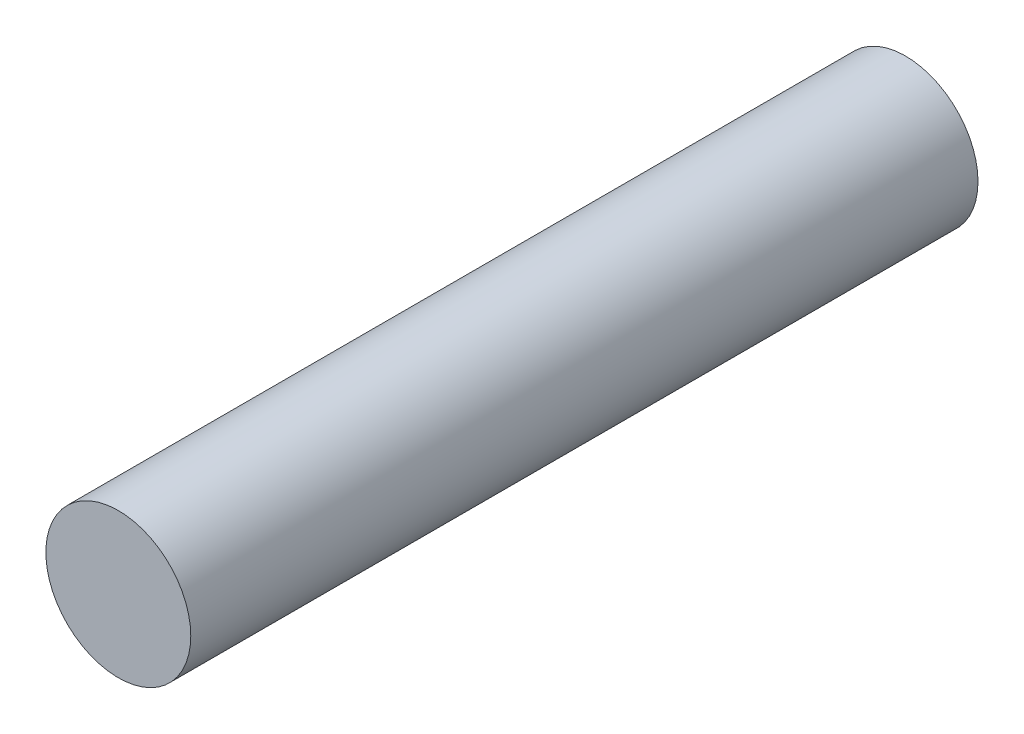
ISO-10303-21;
HEADER;
FILE_DESCRIPTION(('STEP AP214'),'2;1');
FILE_NAME('part.step','',(''),(''),'','','');
FILE_SCHEMA(('AUTOMOTIVE_DESIGN { 1 0 10303 214 1 1 1 1 }'));
ENDSEC;
DATA;
#1=APPLICATION_CONTEXT('core data for automotive mechanical design processes');
#2=APPLICATION_PROTOCOL_DEFINITION('international standard','automotive_design',2000,#1);
#3=PRODUCT_CONTEXT('',#1,'mechanical');
#4=PRODUCT('Part','Part','',(#3));
#5=PRODUCT_RELATED_PRODUCT_CATEGORY('part','',(#4));
#6=PRODUCT_DEFINITION_FORMATION('','',#4);
#7=PRODUCT_DEFINITION_CONTEXT('part definition',#1,'design');
#8=PRODUCT_DEFINITION('design','',#6,#7);
#9=PRODUCT_DEFINITION_SHAPE('','',#8);
#10=(LENGTH_UNIT() NAMED_UNIT(*) SI_UNIT(.MILLI.,.METRE.));
#11=(NAMED_UNIT(*) PLANE_ANGLE_UNIT() SI_UNIT($,.RADIAN.));
#12=(NAMED_UNIT(*) SI_UNIT($,.STERADIAN.) SOLID_ANGLE_UNIT());
#13=UNCERTAINTY_MEASURE_WITH_UNIT(LENGTH_MEASURE(1.E-05),#10,'distance_accuracy_value','');
#14=(GEOMETRIC_REPRESENTATION_CONTEXT(3) GLOBAL_UNCERTAINTY_ASSIGNED_CONTEXT((#13)) GLOBAL_UNIT_ASSIGNED_CONTEXT((#10,
#11,#12)) REPRESENTATION_CONTEXT('',''));
#15=CARTESIAN_POINT('',(0.,0.,0.));
#16=DIRECTION('',(0.,0.,1.));
#17=DIRECTION('',(1.,0.,0.));
#18=AXIS2_PLACEMENT_3D('',#15,#16,#17);
#19=CARTESIAN_POINT('',(0.,0.,110.));
#20=DIRECTION('',(0.,0.,-1.));
#21=DIRECTION('',(-1.,0.,0.));
#22=AXIS2_PLACEMENT_3D('',#19,#20,#21);
#23=CYLINDRICAL_SURFACE('',#22,10.125);
#24=CARTESIAN_POINT('',(0.,0.,110.));
#25=DIRECTION('',(0.,0.,1.));
#26=DIRECTION('',(1.,0.,0.));
#27=AXIS2_PLACEMENT_3D('',#24,#25,#26);
#28=CIRCLE('',#27,10.125);
#29=CARTESIAN_POINT('',(10.125,0.,110.));
#30=VERTEX_POINT('',#29);
#31=EDGE_CURVE('E10',#30,#30,#28,.T.);
#32=ORIENTED_EDGE('',*,*,#31,.F.);
#33=EDGE_LOOP('',(#32));
#34=FACE_BOUND('',#33,.T.);
#35=CARTESIAN_POINT('',(0.,0.,0.));
#36=DIRECTION('',(0.,0.,1.));
#37=DIRECTION('',(1.,0.,0.));
#38=AXIS2_PLACEMENT_3D('',#35,#36,#37);
#39=CIRCLE('',#38,10.125);
#40=CARTESIAN_POINT('',(10.125,0.,0.));
#41=VERTEX_POINT('',#40);
#42=EDGE_CURVE('E34',#41,#41,#39,.T.);
#43=ORIENTED_EDGE('',*,*,#42,.T.);
#44=EDGE_LOOP('',(#43));
#45=FACE_BOUND('',#44,.T.);
#46=ADVANCED_FACE('F31',(#34,#45),#23,.T.);
#47=CARTESIAN_POINT('',(0.,0.,110.));
#48=DIRECTION('',(0.,0.,1.));
#49=DIRECTION('',(1.,0.,0.));
#50=AXIS2_PLACEMENT_3D('',#47,#48,#49);
#51=PLANE('',#50);
#52=ORIENTED_EDGE('',*,*,#31,.T.);
#53=EDGE_LOOP('',(#52));
#54=FACE_BOUND('',#53,.T.);
#55=ADVANCED_FACE('F46',(#54),#51,.T.);
#56=CARTESIAN_POINT('',(0.,0.,0.));
#57=DIRECTION('',(0.,0.,1.));
#58=DIRECTION('',(1.,0.,0.));
#59=AXIS2_PLACEMENT_3D('',#56,#57,#58);
#60=PLANE('',#59);
#61=ORIENTED_EDGE('',*,*,#42,.F.);
#62=EDGE_LOOP('',(#61));
#63=FACE_BOUND('',#62,.T.);
#64=ADVANCED_FACE('F44',(#63),#60,.F.);
#65=CLOSED_SHELL('',(#46,#55,#64));
#66=MANIFOLD_SOLID_BREP('B2',#65);
#67=ADVANCED_BREP_SHAPE_REPRESENTATION('',(#18,#66),#14);
#68=SHAPE_DEFINITION_REPRESENTATION(#9,#67);
ENDSEC;
END-ISO-10303-21;
